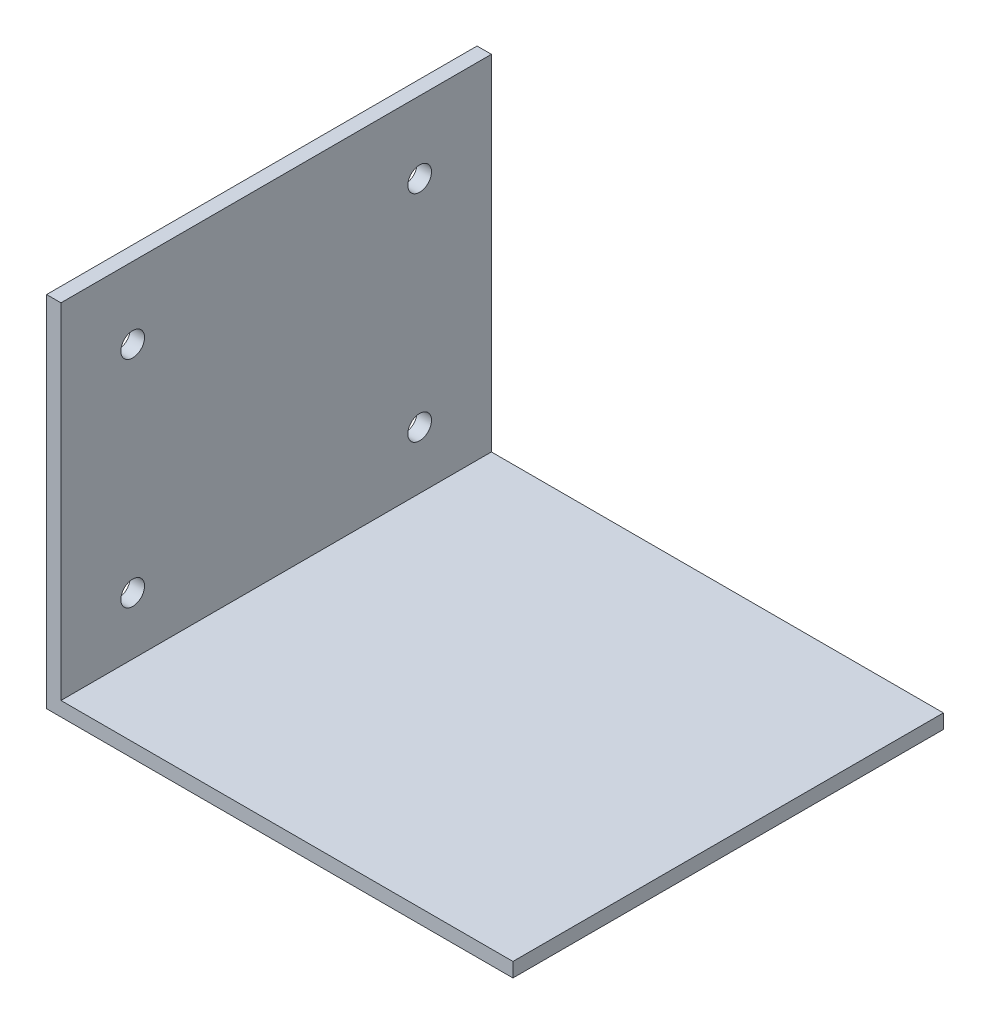
ISO-10303-21;
HEADER;
FILE_DESCRIPTION(('STEP AP214'),'2;1');
FILE_NAME('part.step','',(''),(''),'','','');
FILE_SCHEMA(('AUTOMOTIVE_DESIGN { 1 0 10303 214 1 1 1 1 }'));
ENDSEC;
DATA;
#1=APPLICATION_CONTEXT('core data for automotive mechanical design processes');
#2=APPLICATION_PROTOCOL_DEFINITION('international standard','automotive_design',2000,#1);
#3=PRODUCT_CONTEXT('',#1,'mechanical');
#4=PRODUCT('Part','Part','',(#3));
#5=PRODUCT_RELATED_PRODUCT_CATEGORY('part','',(#4));
#6=PRODUCT_DEFINITION_FORMATION('','',#4);
#7=PRODUCT_DEFINITION_CONTEXT('part definition',#1,'design');
#8=PRODUCT_DEFINITION('design','',#6,#7);
#9=PRODUCT_DEFINITION_SHAPE('','',#8);
#10=(LENGTH_UNIT() NAMED_UNIT(*) SI_UNIT(.MILLI.,.METRE.));
#11=(NAMED_UNIT(*) PLANE_ANGLE_UNIT() SI_UNIT($,.RADIAN.));
#12=(NAMED_UNIT(*) SI_UNIT($,.STERADIAN.) SOLID_ANGLE_UNIT());
#13=UNCERTAINTY_MEASURE_WITH_UNIT(LENGTH_MEASURE(1.E-05),#10,'distance_accuracy_value','');
#14=(GEOMETRIC_REPRESENTATION_CONTEXT(3) GLOBAL_UNCERTAINTY_ASSIGNED_CONTEXT((#13)) GLOBAL_UNIT_ASSIGNED_CONTEXT((#10,
#11,#12)) REPRESENTATION_CONTEXT('',''));
#15=CARTESIAN_POINT('',(0.,0.,0.));
#16=DIRECTION('',(0.,0.,1.));
#17=DIRECTION('',(1.,0.,0.));
#18=AXIS2_PLACEMENT_3D('',#15,#16,#17);
#19=CARTESIAN_POINT('',(130.,0.,120.));
#20=DIRECTION('',(0.,1.,0.));
#21=DIRECTION('',(-1.,0.,0.));
#22=AXIS2_PLACEMENT_3D('',#19,#20,#21);
#23=PLANE('',#22);
#24=DIRECTION('',(1.,0.,0.));
#25=VECTOR('',#24,1.);
#26=CARTESIAN_POINT('',(130.,0.,0.));
#27=LINE('',#26,#25);
#28=CARTESIAN_POINT('',(0.,0.,0.));
#29=VERTEX_POINT('',#28);
#30=CARTESIAN_POINT('',(130.,0.,0.));
#31=VERTEX_POINT('',#30);
#32=EDGE_CURVE('E124',#29,#31,#27,.T.);
#33=ORIENTED_EDGE('',*,*,#32,.T.);
#34=DIRECTION('',(0.,0.,-1.));
#35=VECTOR('',#34,1.);
#36=CARTESIAN_POINT('',(130.,0.,120.));
#37=LINE('',#36,#35);
#38=CARTESIAN_POINT('',(130.,0.,120.));
#39=VERTEX_POINT('',#38);
#40=EDGE_CURVE('E11',#39,#31,#37,.T.);
#41=ORIENTED_EDGE('',*,*,#40,.F.);
#42=DIRECTION('',(1.,0.,0.));
#43=VECTOR('',#42,1.);
#44=CARTESIAN_POINT('',(130.,0.,120.));
#45=LINE('',#44,#43);
#46=CARTESIAN_POINT('',(0.,0.,120.));
#47=VERTEX_POINT('',#46);
#48=EDGE_CURVE('E133',#47,#39,#45,.T.);
#49=ORIENTED_EDGE('',*,*,#48,.F.);
#50=DIRECTION('',(0.,0.,-1.));
#51=VECTOR('',#50,1.);
#52=CARTESIAN_POINT('',(0.,0.,120.));
#53=LINE('',#52,#51);
#54=EDGE_CURVE('E118',#47,#29,#53,.T.);
#55=ORIENTED_EDGE('',*,*,#54,.T.);
#56=EDGE_LOOP('',(#33,#41,#49,#55));
#57=FACE_BOUND('',#56,.T.);
#58=ADVANCED_FACE('F39',(#57),#23,.F.);
#59=CARTESIAN_POINT('',(130.,4.,120.));
#60=DIRECTION('',(-1.,0.,0.));
#61=DIRECTION('',(0.,0.,1.));
#62=AXIS2_PLACEMENT_3D('',#59,#60,#61);
#63=PLANE('',#62);
#64=DIRECTION('',(0.,1.,0.));
#65=VECTOR('',#64,1.);
#66=CARTESIAN_POINT('',(130.,4.,0.));
#67=LINE('',#66,#65);
#68=CARTESIAN_POINT('',(130.,4.,0.));
#69=VERTEX_POINT('',#68);
#70=EDGE_CURVE('E127',#31,#69,#67,.T.);
#71=ORIENTED_EDGE('',*,*,#70,.T.);
#72=DIRECTION('',(0.,0.,-1.));
#73=VECTOR('',#72,1.);
#74=CARTESIAN_POINT('',(130.,4.,120.));
#75=LINE('',#74,#73);
#76=CARTESIAN_POINT('',(130.,4.,120.));
#77=VERTEX_POINT('',#76);
#78=EDGE_CURVE('E50',#77,#69,#75,.T.);
#79=ORIENTED_EDGE('',*,*,#78,.F.);
#80=DIRECTION('',(0.,1.,0.));
#81=VECTOR('',#80,1.);
#82=CARTESIAN_POINT('',(130.,4.,120.));
#83=LINE('',#82,#81);
#84=EDGE_CURVE('E95',#39,#77,#83,.T.);
#85=ORIENTED_EDGE('',*,*,#84,.F.);
#86=ORIENTED_EDGE('',*,*,#40,.T.);
#87=EDGE_LOOP('',(#71,#79,#85,#86));
#88=FACE_BOUND('',#87,.T.);
#89=ADVANCED_FACE('F162',(#88),#63,.F.);
#90=CARTESIAN_POINT('',(4.00000000000001,4.,120.));
#91=DIRECTION('',(0.,-1.,0.));
#92=DIRECTION('',(1.,0.,0.));
#93=AXIS2_PLACEMENT_3D('',#90,#91,#92);
#94=PLANE('',#93);
#95=DIRECTION('',(-1.,0.,0.));
#96=VECTOR('',#95,1.);
#97=CARTESIAN_POINT('',(4.00000000000001,4.,0.));
#98=LINE('',#97,#96);
#99=CARTESIAN_POINT('',(4.00000000000001,4.,0.));
#100=VERTEX_POINT('',#99);
#101=EDGE_CURVE('E129',#69,#100,#98,.T.);
#102=ORIENTED_EDGE('',*,*,#101,.T.);
#103=DIRECTION('',(0.,0.,-1.));
#104=VECTOR('',#103,1.);
#105=CARTESIAN_POINT('',(4.00000000000001,4.,120.));
#106=LINE('',#105,#104);
#107=CARTESIAN_POINT('',(4.00000000000001,4.,120.));
#108=VERTEX_POINT('',#107);
#109=EDGE_CURVE('E111',#108,#100,#106,.T.);
#110=ORIENTED_EDGE('',*,*,#109,.F.);
#111=DIRECTION('',(-1.,0.,0.));
#112=VECTOR('',#111,1.);
#113=CARTESIAN_POINT('',(4.00000000000001,4.,120.));
#114=LINE('',#113,#112);
#115=EDGE_CURVE('E104',#77,#108,#114,.T.);
#116=ORIENTED_EDGE('',*,*,#115,.F.);
#117=ORIENTED_EDGE('',*,*,#78,.T.);
#118=EDGE_LOOP('',(#102,#110,#116,#117));
#119=FACE_BOUND('',#118,.T.);
#120=ADVANCED_FACE('F138',(#119),#94,.F.);
#121=CARTESIAN_POINT('',(4.,100.,120.));
#122=DIRECTION('',(-1.,0.,0.));
#123=DIRECTION('',(0.,-1.,0.));
#124=AXIS2_PLACEMENT_3D('',#121,#122,#123);
#125=PLANE('',#124);
#126=CARTESIAN_POINT('',(4.00000000000001,20.,100.));
#127=DIRECTION('',(1.,0.,0.));
#128=DIRECTION('',(0.,1.,0.));
#129=AXIS2_PLACEMENT_3D('',#126,#127,#128);
#130=CIRCLE('',#129,3.30000000000001);
#131=CARTESIAN_POINT('',(4.00000000000001,23.3,100.));
#132=VERTEX_POINT('',#131);
#133=EDGE_CURVE('E176',#132,#132,#130,.T.);
#134=ORIENTED_EDGE('',*,*,#133,.F.);
#135=EDGE_LOOP('',(#134));
#136=FACE_BOUND('',#135,.T.);
#137=CARTESIAN_POINT('',(4.00000000000001,20.,20.));
#138=DIRECTION('',(1.,0.,0.));
#139=DIRECTION('',(0.,1.,0.));
#140=AXIS2_PLACEMENT_3D('',#137,#138,#139);
#141=CIRCLE('',#140,3.3);
#142=CARTESIAN_POINT('',(4.00000000000001,23.3,20.));
#143=VERTEX_POINT('',#142);
#144=EDGE_CURVE('E181',#143,#143,#141,.T.);
#145=ORIENTED_EDGE('',*,*,#144,.F.);
#146=EDGE_LOOP('',(#145));
#147=FACE_BOUND('',#146,.T.);
#148=CARTESIAN_POINT('',(4.,80.,20.));
#149=DIRECTION('',(1.,0.,0.));
#150=DIRECTION('',(0.,1.,0.));
#151=AXIS2_PLACEMENT_3D('',#148,#149,#150);
#152=CIRCLE('',#151,3.3);
#153=CARTESIAN_POINT('',(4.,83.3,20.));
#154=VERTEX_POINT('',#153);
#155=EDGE_CURVE('E186',#154,#154,#152,.T.);
#156=ORIENTED_EDGE('',*,*,#155,.F.);
#157=EDGE_LOOP('',(#156));
#158=FACE_BOUND('',#157,.T.);
#159=CARTESIAN_POINT('',(4.,80.,100.));
#160=DIRECTION('',(1.,0.,0.));
#161=DIRECTION('',(0.,1.,0.));
#162=AXIS2_PLACEMENT_3D('',#159,#160,#161);
#163=CIRCLE('',#162,3.3);
#164=CARTESIAN_POINT('',(4.,83.3,100.));
#165=VERTEX_POINT('',#164);
#166=EDGE_CURVE('E187',#165,#165,#163,.T.);
#167=ORIENTED_EDGE('',*,*,#166,.F.);
#168=EDGE_LOOP('',(#167));
#169=FACE_BOUND('',#168,.T.);
#170=DIRECTION('',(0.,1.,0.));
#171=VECTOR('',#170,1.);
#172=CARTESIAN_POINT('',(4.,100.,0.));
#173=LINE('',#172,#171);
#174=CARTESIAN_POINT('',(4.,100.,0.));
#175=VERTEX_POINT('',#174);
#176=EDGE_CURVE('E114',#100,#175,#173,.T.);
#177=ORIENTED_EDGE('',*,*,#176,.T.);
#178=DIRECTION('',(0.,0.,-1.));
#179=VECTOR('',#178,1.);
#180=CARTESIAN_POINT('',(4.,100.,120.));
#181=LINE('',#180,#179);
#182=CARTESIAN_POINT('',(4.,100.,120.));
#183=VERTEX_POINT('',#182);
#184=EDGE_CURVE('E109',#183,#175,#181,.T.);
#185=ORIENTED_EDGE('',*,*,#184,.F.);
#186=DIRECTION('',(0.,1.,0.));
#187=VECTOR('',#186,1.);
#188=CARTESIAN_POINT('',(4.,100.,120.));
#189=LINE('',#188,#187);
#190=EDGE_CURVE('E97',#108,#183,#189,.T.);
#191=ORIENTED_EDGE('',*,*,#190,.F.);
#192=ORIENTED_EDGE('',*,*,#109,.T.);
#193=EDGE_LOOP('',(#177,#185,#191,#192));
#194=FACE_BOUND('',#193,.T.);
#195=ADVANCED_FACE('F112',(#136,#147,#158,#169,#194),#125,.F.);
#196=CARTESIAN_POINT('',(0.,100.,120.));
#197=DIRECTION('',(0.,-1.,0.));
#198=DIRECTION('',(0.,0.,-1.));
#199=AXIS2_PLACEMENT_3D('',#196,#197,#198);
#200=PLANE('',#199);
#201=DIRECTION('',(-1.,0.,0.));
#202=VECTOR('',#201,1.);
#203=CARTESIAN_POINT('',(0.,100.,0.));
#204=LINE('',#203,#202);
#205=CARTESIAN_POINT('',(0.,100.,0.));
#206=VERTEX_POINT('',#205);
#207=EDGE_CURVE('E80',#175,#206,#204,.T.);
#208=ORIENTED_EDGE('',*,*,#207,.T.);
#209=DIRECTION('',(0.,0.,-1.));
#210=VECTOR('',#209,1.);
#211=CARTESIAN_POINT('',(0.,100.,120.));
#212=LINE('',#211,#210);
#213=CARTESIAN_POINT('',(0.,100.,120.));
#214=VERTEX_POINT('',#213);
#215=EDGE_CURVE('E113',#214,#206,#212,.T.);
#216=ORIENTED_EDGE('',*,*,#215,.F.);
#217=DIRECTION('',(-1.,0.,0.));
#218=VECTOR('',#217,1.);
#219=CARTESIAN_POINT('',(0.,100.,120.));
#220=LINE('',#219,#218);
#221=EDGE_CURVE('E103',#183,#214,#220,.T.);
#222=ORIENTED_EDGE('',*,*,#221,.F.);
#223=ORIENTED_EDGE('',*,*,#184,.T.);
#224=EDGE_LOOP('',(#208,#216,#222,#223));
#225=FACE_BOUND('',#224,.T.);
#226=ADVANCED_FACE('F116',(#225),#200,.F.);
#227=CARTESIAN_POINT('',(0.,0.,120.));
#228=DIRECTION('',(1.,0.,0.));
#229=DIRECTION('',(0.,0.,-1.));
#230=AXIS2_PLACEMENT_3D('',#227,#228,#229);
#231=PLANE('',#230);
#232=CARTESIAN_POINT('',(0.,20.,100.));
#233=DIRECTION('',(1.,0.,0.));
#234=DIRECTION('',(0.,1.,0.));
#235=AXIS2_PLACEMENT_3D('',#232,#233,#234);
#236=CIRCLE('',#235,3.30000000000001);
#237=CARTESIAN_POINT('',(0.,23.3,100.));
#238=VERTEX_POINT('',#237);
#239=EDGE_CURVE('E199',#238,#238,#236,.T.);
#240=ORIENTED_EDGE('',*,*,#239,.T.);
#241=EDGE_LOOP('',(#240));
#242=FACE_BOUND('',#241,.T.);
#243=CARTESIAN_POINT('',(0.,20.,20.));
#244=DIRECTION('',(1.,0.,0.));
#245=DIRECTION('',(0.,1.,0.));
#246=AXIS2_PLACEMENT_3D('',#243,#244,#245);
#247=CIRCLE('',#246,3.3);
#248=CARTESIAN_POINT('',(0.,23.3,20.));
#249=VERTEX_POINT('',#248);
#250=EDGE_CURVE('E201',#249,#249,#247,.T.);
#251=ORIENTED_EDGE('',*,*,#250,.T.);
#252=EDGE_LOOP('',(#251));
#253=FACE_BOUND('',#252,.T.);
#254=CARTESIAN_POINT('',(0.,80.,20.));
#255=DIRECTION('',(1.,0.,0.));
#256=DIRECTION('',(0.,1.,0.));
#257=AXIS2_PLACEMENT_3D('',#254,#255,#256);
#258=CIRCLE('',#257,3.3);
#259=CARTESIAN_POINT('',(0.,83.3,20.));
#260=VERTEX_POINT('',#259);
#261=EDGE_CURVE('E193',#260,#260,#258,.T.);
#262=ORIENTED_EDGE('',*,*,#261,.T.);
#263=EDGE_LOOP('',(#262));
#264=FACE_BOUND('',#263,.T.);
#265=CARTESIAN_POINT('',(0.,80.,100.));
#266=DIRECTION('',(1.,0.,0.));
#267=DIRECTION('',(0.,1.,0.));
#268=AXIS2_PLACEMENT_3D('',#265,#266,#267);
#269=CIRCLE('',#268,3.3);
#270=CARTESIAN_POINT('',(0.,83.3,100.));
#271=VERTEX_POINT('',#270);
#272=EDGE_CURVE('E130',#271,#271,#269,.T.);
#273=ORIENTED_EDGE('',*,*,#272,.T.);
#274=EDGE_LOOP('',(#273));
#275=FACE_BOUND('',#274,.T.);
#276=DIRECTION('',(0.,-1.,0.));
#277=VECTOR('',#276,1.);
#278=CARTESIAN_POINT('',(0.,0.,0.));
#279=LINE('',#278,#277);
#280=EDGE_CURVE('E81',#206,#29,#279,.T.);
#281=ORIENTED_EDGE('',*,*,#280,.T.);
#282=ORIENTED_EDGE('',*,*,#54,.F.);
#283=DIRECTION('',(0.,-1.,0.));
#284=VECTOR('',#283,1.);
#285=CARTESIAN_POINT('',(0.,0.,120.));
#286=LINE('',#285,#284);
#287=EDGE_CURVE('E54',#214,#47,#286,.T.);
#288=ORIENTED_EDGE('',*,*,#287,.F.);
#289=ORIENTED_EDGE('',*,*,#215,.T.);
#290=EDGE_LOOP('',(#281,#282,#288,#289));
#291=FACE_BOUND('',#290,.T.);
#292=ADVANCED_FACE('F150',(#242,#253,#264,#275,#291),#231,.F.);
#293=CARTESIAN_POINT('',(0.,0.,120.));
#294=DIRECTION('',(0.,0.,-1.));
#295=DIRECTION('',(-1.,0.,0.));
#296=AXIS2_PLACEMENT_3D('',#293,#294,#295);
#297=PLANE('',#296);
#298=ORIENTED_EDGE('',*,*,#48,.T.);
#299=ORIENTED_EDGE('',*,*,#84,.T.);
#300=ORIENTED_EDGE('',*,*,#115,.T.);
#301=ORIENTED_EDGE('',*,*,#190,.T.);
#302=ORIENTED_EDGE('',*,*,#221,.T.);
#303=ORIENTED_EDGE('',*,*,#287,.T.);
#304=EDGE_LOOP('',(#298,#299,#300,#301,#302,#303));
#305=FACE_BOUND('',#304,.T.);
#306=ADVANCED_FACE('F101',(#305),#297,.F.);
#307=CARTESIAN_POINT('',(0.,0.,0.));
#308=DIRECTION('',(0.,0.,-1.));
#309=DIRECTION('',(-1.,0.,0.));
#310=AXIS2_PLACEMENT_3D('',#307,#308,#309);
#311=PLANE('',#310);
#312=ORIENTED_EDGE('',*,*,#32,.F.);
#313=ORIENTED_EDGE('',*,*,#280,.F.);
#314=ORIENTED_EDGE('',*,*,#207,.F.);
#315=ORIENTED_EDGE('',*,*,#176,.F.);
#316=ORIENTED_EDGE('',*,*,#101,.F.);
#317=ORIENTED_EDGE('',*,*,#70,.F.);
#318=EDGE_LOOP('',(#312,#313,#314,#315,#316,#317));
#319=FACE_BOUND('',#318,.T.);
#320=ADVANCED_FACE('F141',(#319),#311,.T.);
#321=CARTESIAN_POINT('',(0.,80.,100.));
#322=DIRECTION('',(1.,0.,0.));
#323=DIRECTION('',(0.,1.,0.));
#324=AXIS2_PLACEMENT_3D('',#321,#322,#323);
#325=CYLINDRICAL_SURFACE('',#324,3.3);
#326=ORIENTED_EDGE('',*,*,#272,.F.);
#327=EDGE_LOOP('',(#326));
#328=FACE_BOUND('',#327,.T.);
#329=ORIENTED_EDGE('',*,*,#166,.T.);
#330=EDGE_LOOP('',(#329));
#331=FACE_BOUND('',#330,.T.);
#332=ADVANCED_FACE('F216',(#328,#331),#325,.F.);
#333=CARTESIAN_POINT('',(0.,80.,20.));
#334=DIRECTION('',(1.,0.,0.));
#335=DIRECTION('',(0.,1.,0.));
#336=AXIS2_PLACEMENT_3D('',#333,#334,#335);
#337=CYLINDRICAL_SURFACE('',#336,3.3);
#338=ORIENTED_EDGE('',*,*,#261,.F.);
#339=EDGE_LOOP('',(#338));
#340=FACE_BOUND('',#339,.T.);
#341=ORIENTED_EDGE('',*,*,#155,.T.);
#342=EDGE_LOOP('',(#341));
#343=FACE_BOUND('',#342,.T.);
#344=ADVANCED_FACE('F215',(#340,#343),#337,.F.);
#345=CARTESIAN_POINT('',(0.,20.,20.));
#346=DIRECTION('',(1.,0.,0.));
#347=DIRECTION('',(0.,1.,0.));
#348=AXIS2_PLACEMENT_3D('',#345,#346,#347);
#349=CYLINDRICAL_SURFACE('',#348,3.3);
#350=ORIENTED_EDGE('',*,*,#250,.F.);
#351=EDGE_LOOP('',(#350));
#352=FACE_BOUND('',#351,.T.);
#353=ORIENTED_EDGE('',*,*,#144,.T.);
#354=EDGE_LOOP('',(#353));
#355=FACE_BOUND('',#354,.T.);
#356=ADVANCED_FACE('F214',(#352,#355),#349,.F.);
#357=CARTESIAN_POINT('',(0.,20.,100.));
#358=DIRECTION('',(1.,0.,0.));
#359=DIRECTION('',(0.,1.,0.));
#360=AXIS2_PLACEMENT_3D('',#357,#358,#359);
#361=CYLINDRICAL_SURFACE('',#360,3.30000000000001);
#362=ORIENTED_EDGE('',*,*,#239,.F.);
#363=EDGE_LOOP('',(#362));
#364=FACE_BOUND('',#363,.T.);
#365=ORIENTED_EDGE('',*,*,#133,.T.);
#366=EDGE_LOOP('',(#365));
#367=FACE_BOUND('',#366,.T.);
#368=ADVANCED_FACE('F222',(#364,#367),#361,.F.);
#369=CLOSED_SHELL('',(#58,#89,#120,#195,#226,#292,#306,#320,#332,#344,#356,#368));
#370=MANIFOLD_SOLID_BREP('B2',#369);
#371=ADVANCED_BREP_SHAPE_REPRESENTATION('',(#18,#370),#14);
#372=SHAPE_DEFINITION_REPRESENTATION(#9,#371);
ENDSEC;
END-ISO-10303-21;
